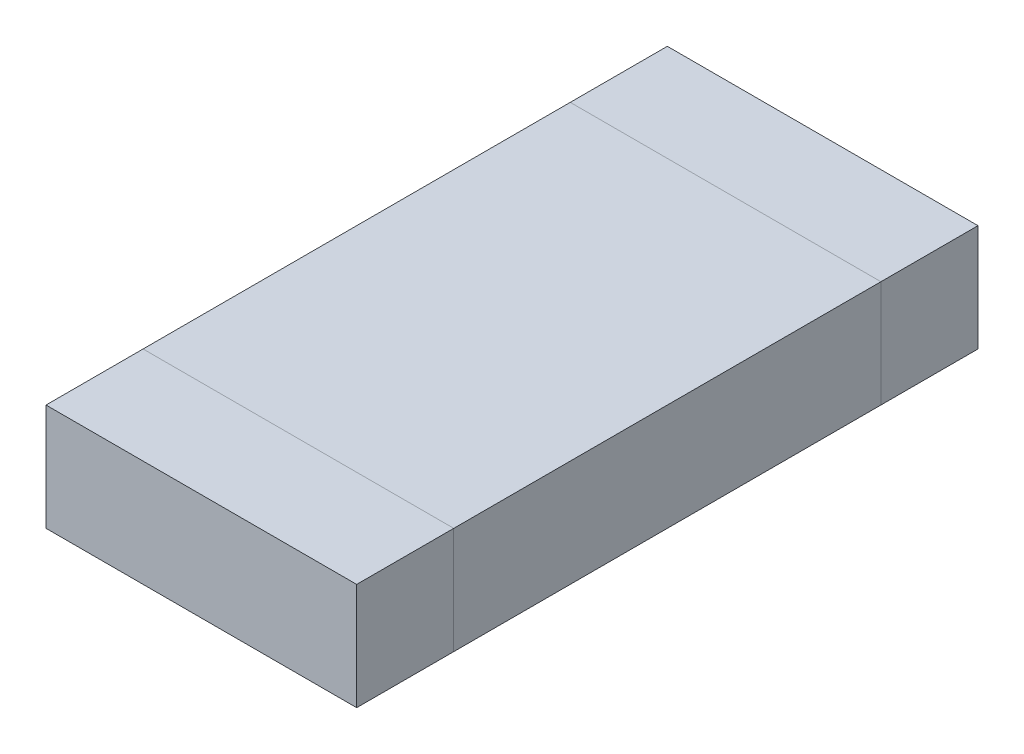
ISO-10303-21;
HEADER;
FILE_DESCRIPTION(('STEP AP214'),'2;1');
FILE_NAME('part.step','',(''),(''),'','','');
FILE_SCHEMA(('AUTOMOTIVE_DESIGN { 1 0 10303 214 1 1 1 1 }'));
ENDSEC;
DATA;
#1=APPLICATION_CONTEXT('core data for automotive mechanical design processes');
#2=APPLICATION_PROTOCOL_DEFINITION('international standard','automotive_design',2000,#1);
#3=PRODUCT_CONTEXT('',#1,'mechanical');
#4=PRODUCT('Part','Part','',(#3));
#5=PRODUCT_RELATED_PRODUCT_CATEGORY('part','',(#4));
#6=PRODUCT_DEFINITION_FORMATION('','',#4);
#7=PRODUCT_DEFINITION_CONTEXT('part definition',#1,'design');
#8=PRODUCT_DEFINITION('design','',#6,#7);
#9=PRODUCT_DEFINITION_SHAPE('','',#8);
#10=(LENGTH_UNIT() NAMED_UNIT(*) SI_UNIT(.MILLI.,.METRE.));
#11=(NAMED_UNIT(*) PLANE_ANGLE_UNIT() SI_UNIT($,.RADIAN.));
#12=(NAMED_UNIT(*) SI_UNIT($,.STERADIAN.) SOLID_ANGLE_UNIT());
#13=UNCERTAINTY_MEASURE_WITH_UNIT(LENGTH_MEASURE(1.E-05),#10,'distance_accuracy_value','');
#14=(GEOMETRIC_REPRESENTATION_CONTEXT(3) GLOBAL_UNCERTAINTY_ASSIGNED_CONTEXT((#13)) GLOBAL_UNIT_ASSIGNED_CONTEXT((#10,
#11,#12)) REPRESENTATION_CONTEXT('',''));
#15=CARTESIAN_POINT('',(0.,0.,0.));
#16=DIRECTION('',(0.,0.,1.));
#17=DIRECTION('',(1.,0.,0.));
#18=AXIS2_PLACEMENT_3D('',#15,#16,#17);
#19=CARTESIAN_POINT('',(0.,0.55,0.));
#20=DIRECTION('',(0.,1.,0.));
#21=DIRECTION('',(0.,0.,1.));
#22=AXIS2_PLACEMENT_3D('',#19,#20,#21);
#23=PLANE('',#22);
#24=DIRECTION('',(0.,0.,-1.));
#25=VECTOR('',#24,1.);
#26=CARTESIAN_POINT('',(-0.8,0.55,-1.1));
#27=LINE('',#26,#25);
#28=CARTESIAN_POINT('',(-0.8,0.55,-1.1));
#29=VERTEX_POINT('',#28);
#30=CARTESIAN_POINT('',(-0.8,0.55,-1.6));
#31=VERTEX_POINT('',#30);
#32=EDGE_CURVE('E53',#29,#31,#27,.T.);
#33=ORIENTED_EDGE('',*,*,#32,.F.);
#34=DIRECTION('',(-1.,0.,0.));
#35=VECTOR('',#34,1.);
#36=CARTESIAN_POINT('',(-0.8,0.55,-1.1));
#37=LINE('',#36,#35);
#38=CARTESIAN_POINT('',(0.8,0.55,-1.1));
#39=VERTEX_POINT('',#38);
#40=EDGE_CURVE('E76',#39,#29,#37,.T.);
#41=ORIENTED_EDGE('',*,*,#40,.F.);
#42=DIRECTION('',(0.,0.,1.));
#43=VECTOR('',#42,1.);
#44=CARTESIAN_POINT('',(0.8,0.55,-1.1));
#45=LINE('',#44,#43);
#46=CARTESIAN_POINT('',(0.8,0.55,-1.6));
#47=VERTEX_POINT('',#46);
#48=EDGE_CURVE('E81',#47,#39,#45,.T.);
#49=ORIENTED_EDGE('',*,*,#48,.F.);
#50=DIRECTION('',(1.,0.,0.));
#51=VECTOR('',#50,1.);
#52=CARTESIAN_POINT('',(-0.8,0.55,-1.6));
#53=LINE('',#52,#51);
#54=EDGE_CURVE('E96',#31,#47,#53,.T.);
#55=ORIENTED_EDGE('',*,*,#54,.F.);
#56=EDGE_LOOP('',(#33,#41,#49,#55));
#57=FACE_BOUND('',#56,.T.);
#58=ADVANCED_FACE('F45',(#57),#23,.T.);
#59=CARTESIAN_POINT('',(0.,0.,0.));
#60=DIRECTION('',(0.,-1.,0.));
#61=DIRECTION('',(0.,0.,-1.));
#62=AXIS2_PLACEMENT_3D('',#59,#60,#61);
#63=PLANE('',#62);
#64=DIRECTION('',(0.,0.,-1.));
#65=VECTOR('',#64,1.);
#66=CARTESIAN_POINT('',(-0.8,0.,-1.1));
#67=LINE('',#66,#65);
#68=CARTESIAN_POINT('',(-0.8,0.,-1.1));
#69=VERTEX_POINT('',#68);
#70=CARTESIAN_POINT('',(-0.8,0.,-1.6));
#71=VERTEX_POINT('',#70);
#72=EDGE_CURVE('E105',#69,#71,#67,.T.);
#73=ORIENTED_EDGE('',*,*,#72,.T.);
#74=DIRECTION('',(1.,0.,0.));
#75=VECTOR('',#74,1.);
#76=CARTESIAN_POINT('',(-0.8,0.,-1.6));
#77=LINE('',#76,#75);
#78=CARTESIAN_POINT('',(0.8,0.,-1.6));
#79=VERTEX_POINT('',#78);
#80=EDGE_CURVE('E94',#71,#79,#77,.T.);
#81=ORIENTED_EDGE('',*,*,#80,.T.);
#82=DIRECTION('',(0.,0.,1.));
#83=VECTOR('',#82,1.);
#84=CARTESIAN_POINT('',(0.8,0.,-1.1));
#85=LINE('',#84,#83);
#86=CARTESIAN_POINT('',(0.8,0.,-1.1));
#87=VERTEX_POINT('',#86);
#88=EDGE_CURVE('E97',#79,#87,#85,.T.);
#89=ORIENTED_EDGE('',*,*,#88,.T.);
#90=DIRECTION('',(-1.,0.,0.));
#91=VECTOR('',#90,1.);
#92=CARTESIAN_POINT('',(-0.8,0.,-1.1));
#93=LINE('',#92,#91);
#94=EDGE_CURVE('E102',#87,#69,#93,.T.);
#95=ORIENTED_EDGE('',*,*,#94,.T.);
#96=EDGE_LOOP('',(#73,#81,#89,#95));
#97=FACE_BOUND('',#96,.T.);
#98=ADVANCED_FACE('F104',(#97),#63,.T.);
#99=CARTESIAN_POINT('',(-0.8,2.22630546142402,-1.6));
#100=DIRECTION('',(0.,0.,-1.));
#101=DIRECTION('',(-1.,0.,0.));
#102=AXIS2_PLACEMENT_3D('',#99,#100,#101);
#103=PLANE('',#102);
#104=DIRECTION('',(0.,-1.,0.));
#105=VECTOR('',#104,1.);
#106=CARTESIAN_POINT('',(-0.8,2.22630546142402,-1.6));
#107=LINE('',#106,#105);
#108=EDGE_CURVE('E12',#31,#71,#107,.T.);
#109=ORIENTED_EDGE('',*,*,#108,.F.);
#110=ORIENTED_EDGE('',*,*,#54,.T.);
#111=DIRECTION('',(0.,-1.,0.));
#112=VECTOR('',#111,1.);
#113=CARTESIAN_POINT('',(0.8,2.22630546142402,-1.6));
#114=LINE('',#113,#112);
#115=EDGE_CURVE('E91',#47,#79,#114,.T.);
#116=ORIENTED_EDGE('',*,*,#115,.T.);
#117=ORIENTED_EDGE('',*,*,#80,.F.);
#118=EDGE_LOOP('',(#109,#110,#116,#117));
#119=FACE_BOUND('',#118,.T.);
#120=ADVANCED_FACE('F92',(#119),#103,.T.);
#121=CARTESIAN_POINT('',(0.8,2.22630546142402,-1.1));
#122=DIRECTION('',(1.,0.,0.));
#123=DIRECTION('',(0.,0.,-1.));
#124=AXIS2_PLACEMENT_3D('',#121,#122,#123);
#125=PLANE('',#124);
#126=ORIENTED_EDGE('',*,*,#115,.F.);
#127=ORIENTED_EDGE('',*,*,#48,.T.);
#128=DIRECTION('',(0.,-1.,0.));
#129=VECTOR('',#128,1.);
#130=CARTESIAN_POINT('',(0.8,2.22630546142402,-1.1));
#131=LINE('',#130,#129);
#132=EDGE_CURVE('E86',#39,#87,#131,.T.);
#133=ORIENTED_EDGE('',*,*,#132,.T.);
#134=ORIENTED_EDGE('',*,*,#88,.F.);
#135=EDGE_LOOP('',(#126,#127,#133,#134));
#136=FACE_BOUND('',#135,.T.);
#137=ADVANCED_FACE('F98',(#136),#125,.T.);
#138=CARTESIAN_POINT('',(-0.8,2.22630546142402,-1.1));
#139=DIRECTION('',(0.,0.,1.));
#140=DIRECTION('',(1.,0.,0.));
#141=AXIS2_PLACEMENT_3D('',#138,#139,#140);
#142=PLANE('',#141);
#143=ORIENTED_EDGE('',*,*,#132,.F.);
#144=ORIENTED_EDGE('',*,*,#40,.T.);
#145=DIRECTION('',(0.,-1.,0.));
#146=VECTOR('',#145,1.);
#147=CARTESIAN_POINT('',(-0.8,2.22630546142402,-1.1));
#148=LINE('',#147,#146);
#149=EDGE_CURVE('E112',#29,#69,#148,.T.);
#150=ORIENTED_EDGE('',*,*,#149,.T.);
#151=ORIENTED_EDGE('',*,*,#94,.F.);
#152=EDGE_LOOP('',(#143,#144,#150,#151));
#153=FACE_BOUND('',#152,.T.);
#154=ADVANCED_FACE('F118',(#153),#142,.T.);
#155=CARTESIAN_POINT('',(-0.8,2.22630546142402,-1.1));
#156=DIRECTION('',(-1.,0.,0.));
#157=DIRECTION('',(0.,0.,1.));
#158=AXIS2_PLACEMENT_3D('',#155,#156,#157);
#159=PLANE('',#158);
#160=ORIENTED_EDGE('',*,*,#149,.F.);
#161=ORIENTED_EDGE('',*,*,#32,.T.);
#162=ORIENTED_EDGE('',*,*,#108,.T.);
#163=ORIENTED_EDGE('',*,*,#72,.F.);
#164=EDGE_LOOP('',(#160,#161,#162,#163));
#165=FACE_BOUND('',#164,.T.);
#166=ADVANCED_FACE('F119',(#165),#159,.T.);
#167=CLOSED_SHELL('',(#58,#98,#120,#137,#154,#166));
#168=MANIFOLD_SOLID_BREP('B2',#167);
#169=CARTESIAN_POINT('',(0.,0.55,0.));
#170=DIRECTION('',(0.,1.,0.));
#171=DIRECTION('',(0.,0.,1.));
#172=AXIS2_PLACEMENT_3D('',#169,#170,#171);
#173=PLANE('',#172);
#174=DIRECTION('',(0.,0.,-1.));
#175=VECTOR('',#174,1.);
#176=CARTESIAN_POINT('',(-0.8,0.55,1.1));
#177=LINE('',#176,#175);
#178=CARTESIAN_POINT('',(-0.8,0.55,1.6));
#179=VERTEX_POINT('',#178);
#180=CARTESIAN_POINT('',(-0.8,0.55,1.1));
#181=VERTEX_POINT('',#180);
#182=EDGE_CURVE('E185',#179,#181,#177,.T.);
#183=ORIENTED_EDGE('',*,*,#182,.F.);
#184=DIRECTION('',(-1.,0.,0.));
#185=VECTOR('',#184,1.);
#186=CARTESIAN_POINT('',(-0.8,0.55,1.6));
#187=LINE('',#186,#185);
#188=CARTESIAN_POINT('',(0.8,0.55,1.6));
#189=VERTEX_POINT('',#188);
#190=EDGE_CURVE('E208',#189,#179,#187,.T.);
#191=ORIENTED_EDGE('',*,*,#190,.F.);
#192=DIRECTION('',(0.,0.,1.));
#193=VECTOR('',#192,1.);
#194=CARTESIAN_POINT('',(0.8,0.55,1.1));
#195=LINE('',#194,#193);
#196=CARTESIAN_POINT('',(0.8,0.55,1.1));
#197=VERTEX_POINT('',#196);
#198=EDGE_CURVE('E213',#197,#189,#195,.T.);
#199=ORIENTED_EDGE('',*,*,#198,.F.);
#200=DIRECTION('',(1.,0.,0.));
#201=VECTOR('',#200,1.);
#202=CARTESIAN_POINT('',(-0.8,0.55,1.1));
#203=LINE('',#202,#201);
#204=EDGE_CURVE('E228',#181,#197,#203,.T.);
#205=ORIENTED_EDGE('',*,*,#204,.F.);
#206=EDGE_LOOP('',(#183,#191,#199,#205));
#207=FACE_BOUND('',#206,.T.);
#208=ADVANCED_FACE('F177',(#207),#173,.T.);
#209=CARTESIAN_POINT('',(0.,0.,0.));
#210=DIRECTION('',(0.,1.,0.));
#211=DIRECTION('',(0.,0.,1.));
#212=AXIS2_PLACEMENT_3D('',#209,#210,#211);
#213=PLANE('',#212);
#214=DIRECTION('',(0.,0.,-1.));
#215=VECTOR('',#214,1.);
#216=CARTESIAN_POINT('',(-0.8,0.,1.1));
#217=LINE('',#216,#215);
#218=CARTESIAN_POINT('',(-0.8,0.,1.6));
#219=VERTEX_POINT('',#218);
#220=CARTESIAN_POINT('',(-0.8,0.,1.1));
#221=VERTEX_POINT('',#220);
#222=EDGE_CURVE('E237',#219,#221,#217,.T.);
#223=ORIENTED_EDGE('',*,*,#222,.T.);
#224=DIRECTION('',(1.,0.,0.));
#225=VECTOR('',#224,1.);
#226=CARTESIAN_POINT('',(-0.8,0.,1.1));
#227=LINE('',#226,#225);
#228=CARTESIAN_POINT('',(0.8,0.,1.1));
#229=VERTEX_POINT('',#228);
#230=EDGE_CURVE('E226',#221,#229,#227,.T.);
#231=ORIENTED_EDGE('',*,*,#230,.T.);
#232=DIRECTION('',(0.,0.,1.));
#233=VECTOR('',#232,1.);
#234=CARTESIAN_POINT('',(0.8,0.,1.1));
#235=LINE('',#234,#233);
#236=CARTESIAN_POINT('',(0.8,0.,1.6));
#237=VERTEX_POINT('',#236);
#238=EDGE_CURVE('E229',#229,#237,#235,.T.);
#239=ORIENTED_EDGE('',*,*,#238,.T.);
#240=DIRECTION('',(-1.,0.,0.));
#241=VECTOR('',#240,1.);
#242=CARTESIAN_POINT('',(-0.8,0.,1.6));
#243=LINE('',#242,#241);
#244=EDGE_CURVE('E234',#237,#219,#243,.T.);
#245=ORIENTED_EDGE('',*,*,#244,.T.);
#246=EDGE_LOOP('',(#223,#231,#239,#245));
#247=FACE_BOUND('',#246,.T.);
#248=ADVANCED_FACE('F236',(#247),#213,.F.);
#249=CARTESIAN_POINT('',(-0.8,2.22630546142402,1.1));
#250=DIRECTION('',(0.,0.,-1.));
#251=DIRECTION('',(-1.,0.,0.));
#252=AXIS2_PLACEMENT_3D('',#249,#250,#251);
#253=PLANE('',#252);
#254=DIRECTION('',(0.,-1.,0.));
#255=VECTOR('',#254,1.);
#256=CARTESIAN_POINT('',(-0.8,2.22630546142402,1.1));
#257=LINE('',#256,#255);
#258=EDGE_CURVE('E43',#181,#221,#257,.T.);
#259=ORIENTED_EDGE('',*,*,#258,.F.);
#260=ORIENTED_EDGE('',*,*,#204,.T.);
#261=DIRECTION('',(0.,-1.,0.));
#262=VECTOR('',#261,1.);
#263=CARTESIAN_POINT('',(0.8,2.22630546142402,1.1));
#264=LINE('',#263,#262);
#265=EDGE_CURVE('E223',#197,#229,#264,.T.);
#266=ORIENTED_EDGE('',*,*,#265,.T.);
#267=ORIENTED_EDGE('',*,*,#230,.F.);
#268=EDGE_LOOP('',(#259,#260,#266,#267));
#269=FACE_BOUND('',#268,.T.);
#270=ADVANCED_FACE('F224',(#269),#253,.T.);
#271=CARTESIAN_POINT('',(0.8,2.22630546142402,1.1));
#272=DIRECTION('',(1.,0.,0.));
#273=DIRECTION('',(0.,0.,-1.));
#274=AXIS2_PLACEMENT_3D('',#271,#272,#273);
#275=PLANE('',#274);
#276=ORIENTED_EDGE('',*,*,#265,.F.);
#277=ORIENTED_EDGE('',*,*,#198,.T.);
#278=DIRECTION('',(0.,-1.,0.));
#279=VECTOR('',#278,1.);
#280=CARTESIAN_POINT('',(0.8,2.22630546142402,1.6));
#281=LINE('',#280,#279);
#282=EDGE_CURVE('E218',#189,#237,#281,.T.);
#283=ORIENTED_EDGE('',*,*,#282,.T.);
#284=ORIENTED_EDGE('',*,*,#238,.F.);
#285=EDGE_LOOP('',(#276,#277,#283,#284));
#286=FACE_BOUND('',#285,.T.);
#287=ADVANCED_FACE('F230',(#286),#275,.T.);
#288=CARTESIAN_POINT('',(-0.8,2.22630546142402,1.6));
#289=DIRECTION('',(0.,0.,1.));
#290=DIRECTION('',(1.,0.,0.));
#291=AXIS2_PLACEMENT_3D('',#288,#289,#290);
#292=PLANE('',#291);
#293=ORIENTED_EDGE('',*,*,#282,.F.);
#294=ORIENTED_EDGE('',*,*,#190,.T.);
#295=DIRECTION('',(0.,-1.,0.));
#296=VECTOR('',#295,1.);
#297=CARTESIAN_POINT('',(-0.8,2.22630546142402,1.6));
#298=LINE('',#297,#296);
#299=EDGE_CURVE('E244',#179,#219,#298,.T.);
#300=ORIENTED_EDGE('',*,*,#299,.T.);
#301=ORIENTED_EDGE('',*,*,#244,.F.);
#302=EDGE_LOOP('',(#293,#294,#300,#301));
#303=FACE_BOUND('',#302,.T.);
#304=ADVANCED_FACE('F250',(#303),#292,.T.);
#305=CARTESIAN_POINT('',(-0.8,2.22630546142402,1.1));
#306=DIRECTION('',(-1.,0.,0.));
#307=DIRECTION('',(0.,0.,1.));
#308=AXIS2_PLACEMENT_3D('',#305,#306,#307);
#309=PLANE('',#308);
#310=ORIENTED_EDGE('',*,*,#299,.F.);
#311=ORIENTED_EDGE('',*,*,#182,.T.);
#312=ORIENTED_EDGE('',*,*,#258,.T.);
#313=ORIENTED_EDGE('',*,*,#222,.F.);
#314=EDGE_LOOP('',(#310,#311,#312,#313));
#315=FACE_BOUND('',#314,.T.);
#316=ADVANCED_FACE('F251',(#315),#309,.T.);
#317=CLOSED_SHELL('',(#208,#248,#270,#287,#304,#316));
#318=MANIFOLD_SOLID_BREP('B6',#317);
#319=CARTESIAN_POINT('',(0.8,0.55,-1.1));
#320=DIRECTION('',(-1.,0.,0.));
#321=DIRECTION('',(0.,0.,1.));
#322=AXIS2_PLACEMENT_3D('',#319,#320,#321);
#323=PLANE('',#322);
#324=DIRECTION('',(0.,0.,-1.));
#325=VECTOR('',#324,1.);
#326=CARTESIAN_POINT('',(0.8,0.,-1.1));
#327=LINE('',#326,#325);
#328=CARTESIAN_POINT('',(0.8,0.,1.1));
#329=VERTEX_POINT('',#328);
#330=CARTESIAN_POINT('',(0.8,0.,-1.1));
#331=VERTEX_POINT('',#330);
#332=EDGE_CURVE('E363',#329,#331,#327,.T.);
#333=ORIENTED_EDGE('',*,*,#332,.T.);
#334=DIRECTION('',(0.,-1.,0.));
#335=VECTOR('',#334,1.);
#336=CARTESIAN_POINT('',(0.8,0.55,-1.1));
#337=LINE('',#336,#335);
#338=CARTESIAN_POINT('',(0.8,0.55,-1.1));
#339=VERTEX_POINT('',#338);
#340=EDGE_CURVE('E175',#339,#331,#337,.T.);
#341=ORIENTED_EDGE('',*,*,#340,.F.);
#342=DIRECTION('',(0.,0.,-1.));
#343=VECTOR('',#342,1.);
#344=CARTESIAN_POINT('',(0.8,0.55,-1.1));
#345=LINE('',#344,#343);
#346=CARTESIAN_POINT('',(0.8,0.55,1.1));
#347=VERTEX_POINT('',#346);
#348=EDGE_CURVE('E351',#347,#339,#345,.T.);
#349=ORIENTED_EDGE('',*,*,#348,.F.);
#350=DIRECTION('',(0.,-1.,0.));
#351=VECTOR('',#350,1.);
#352=CARTESIAN_POINT('',(0.8,0.55,1.1));
#353=LINE('',#352,#351);
#354=EDGE_CURVE('E359',#347,#329,#353,.T.);
#355=ORIENTED_EDGE('',*,*,#354,.T.);
#356=EDGE_LOOP('',(#333,#341,#349,#355));
#357=FACE_BOUND('',#356,.T.);
#358=ADVANCED_FACE('F300',(#357),#323,.F.);
#359=CARTESIAN_POINT('',(-0.8,0.55,-1.1));
#360=DIRECTION('',(0.,0.,1.));
#361=DIRECTION('',(1.,0.,0.));
#362=AXIS2_PLACEMENT_3D('',#359,#360,#361);
#363=PLANE('',#362);
#364=DIRECTION('',(-1.,0.,0.));
#365=VECTOR('',#364,1.);
#366=CARTESIAN_POINT('',(-0.8,0.,-1.1));
#367=LINE('',#366,#365);
#368=CARTESIAN_POINT('',(-0.8,0.,-1.1));
#369=VERTEX_POINT('',#368);
#370=EDGE_CURVE('E355',#331,#369,#367,.T.);
#371=ORIENTED_EDGE('',*,*,#370,.T.);
#372=DIRECTION('',(0.,-1.,0.));
#373=VECTOR('',#372,1.);
#374=CARTESIAN_POINT('',(-0.8,0.55,-1.1));
#375=LINE('',#374,#373);
#376=CARTESIAN_POINT('',(-0.8,0.55,-1.1));
#377=VERTEX_POINT('',#376);
#378=EDGE_CURVE('E308',#377,#369,#375,.T.);
#379=ORIENTED_EDGE('',*,*,#378,.F.);
#380=DIRECTION('',(-1.,0.,0.));
#381=VECTOR('',#380,1.);
#382=CARTESIAN_POINT('',(-0.8,0.55,-1.1));
#383=LINE('',#382,#381);
#384=EDGE_CURVE('E346',#339,#377,#383,.T.);
#385=ORIENTED_EDGE('',*,*,#384,.F.);
#386=ORIENTED_EDGE('',*,*,#340,.T.);
#387=EDGE_LOOP('',(#371,#379,#385,#386));
#388=FACE_BOUND('',#387,.T.);
#389=ADVANCED_FACE('F354',(#388),#363,.F.);
#390=CARTESIAN_POINT('',(-0.8,0.55,-1.1));
#391=DIRECTION('',(1.,0.,0.));
#392=DIRECTION('',(0.,0.,-1.));
#393=AXIS2_PLACEMENT_3D('',#390,#391,#392);
#394=PLANE('',#393);
#395=DIRECTION('',(0.,0.,1.));
#396=VECTOR('',#395,1.);
#397=CARTESIAN_POINT('',(-0.8,0.,-1.1));
#398=LINE('',#397,#396);
#399=CARTESIAN_POINT('',(-0.8,0.,1.1));
#400=VERTEX_POINT('',#399);
#401=EDGE_CURVE('E333',#369,#400,#398,.T.);
#402=ORIENTED_EDGE('',*,*,#401,.T.);
#403=DIRECTION('',(0.,-1.,0.));
#404=VECTOR('',#403,1.);
#405=CARTESIAN_POINT('',(-0.8,0.55,1.1));
#406=LINE('',#405,#404);
#407=CARTESIAN_POINT('',(-0.8,0.55,1.1));
#408=VERTEX_POINT('',#407);
#409=EDGE_CURVE('E356',#408,#400,#406,.T.);
#410=ORIENTED_EDGE('',*,*,#409,.F.);
#411=DIRECTION('',(0.,0.,1.));
#412=VECTOR('',#411,1.);
#413=CARTESIAN_POINT('',(-0.8,0.55,-1.1));
#414=LINE('',#413,#412);
#415=EDGE_CURVE('E349',#377,#408,#414,.T.);
#416=ORIENTED_EDGE('',*,*,#415,.F.);
#417=ORIENTED_EDGE('',*,*,#378,.T.);
#418=EDGE_LOOP('',(#402,#410,#416,#417));
#419=FACE_BOUND('',#418,.T.);
#420=ADVANCED_FACE('F357',(#419),#394,.F.);
#421=CARTESIAN_POINT('',(-0.8,0.55,1.1));
#422=DIRECTION('',(0.,0.,-1.));
#423=DIRECTION('',(-1.,0.,0.));
#424=AXIS2_PLACEMENT_3D('',#421,#422,#423);
#425=PLANE('',#424);
#426=DIRECTION('',(1.,0.,0.));
#427=VECTOR('',#426,1.);
#428=CARTESIAN_POINT('',(-0.8,0.,1.1));
#429=LINE('',#428,#427);
#430=EDGE_CURVE('E339',#400,#329,#429,.T.);
#431=ORIENTED_EDGE('',*,*,#430,.T.);
#432=ORIENTED_EDGE('',*,*,#354,.F.);
#433=DIRECTION('',(1.,0.,0.));
#434=VECTOR('',#433,1.);
#435=CARTESIAN_POINT('',(-0.8,0.55,1.1));
#436=LINE('',#435,#434);
#437=EDGE_CURVE('E316',#408,#347,#436,.T.);
#438=ORIENTED_EDGE('',*,*,#437,.F.);
#439=ORIENTED_EDGE('',*,*,#409,.T.);
#440=EDGE_LOOP('',(#431,#432,#438,#439));
#441=FACE_BOUND('',#440,.T.);
#442=ADVANCED_FACE('F370',(#441),#425,.F.);
#443=CARTESIAN_POINT('',(0.,0.55,0.));
#444=DIRECTION('',(0.,1.,0.));
#445=DIRECTION('',(0.,0.,1.));
#446=AXIS2_PLACEMENT_3D('',#443,#444,#445);
#447=PLANE('',#446);
#448=ORIENTED_EDGE('',*,*,#348,.T.);
#449=ORIENTED_EDGE('',*,*,#384,.T.);
#450=ORIENTED_EDGE('',*,*,#415,.T.);
#451=ORIENTED_EDGE('',*,*,#437,.T.);
#452=EDGE_LOOP('',(#448,#449,#450,#451));
#453=FACE_BOUND('',#452,.T.);
#454=ADVANCED_FACE('F347',(#453),#447,.T.);
#455=CARTESIAN_POINT('',(0.,0.,0.));
#456=DIRECTION('',(0.,1.,0.));
#457=DIRECTION('',(0.,0.,1.));
#458=AXIS2_PLACEMENT_3D('',#455,#456,#457);
#459=PLANE('',#458);
#460=ORIENTED_EDGE('',*,*,#332,.F.);
#461=ORIENTED_EDGE('',*,*,#430,.F.);
#462=ORIENTED_EDGE('',*,*,#401,.F.);
#463=ORIENTED_EDGE('',*,*,#370,.F.);
#464=EDGE_LOOP('',(#460,#461,#462,#463));
#465=FACE_BOUND('',#464,.T.);
#466=ADVANCED_FACE('F373',(#465),#459,.F.);
#467=CLOSED_SHELL('',(#358,#389,#420,#442,#454,#466));
#468=MANIFOLD_SOLID_BREP('B37',#467);
#469=ADVANCED_BREP_SHAPE_REPRESENTATION('',(#18,#168,#318,#468),#14);
#470=SHAPE_DEFINITION_REPRESENTATION(#9,#469);
ENDSEC;
END-ISO-10303-21;
